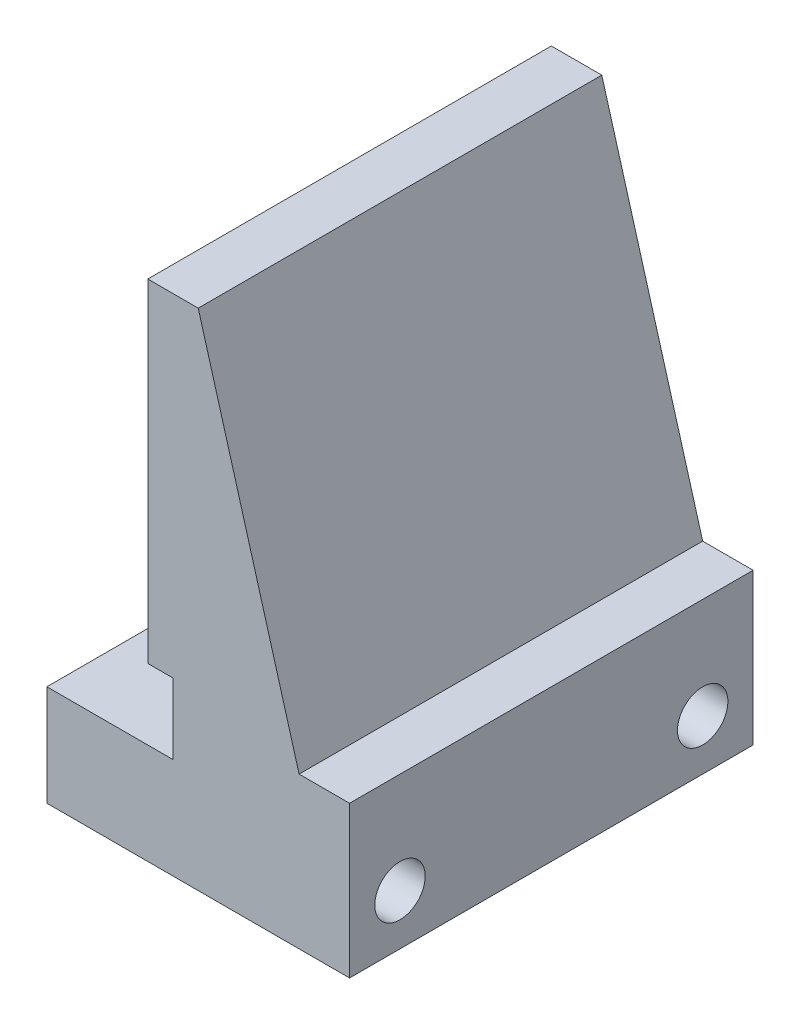
ISO-10303-21;
HEADER;
FILE_DESCRIPTION(('STEP AP214'),'2;1');
FILE_NAME('part.step','',(''),(''),'','','');
FILE_SCHEMA(('AUTOMOTIVE_DESIGN { 1 0 10303 214 1 1 1 1 }'));
ENDSEC;
DATA;
#1=APPLICATION_CONTEXT('core data for automotive mechanical design processes');
#2=APPLICATION_PROTOCOL_DEFINITION('international standard','automotive_design',2000,#1);
#3=PRODUCT_CONTEXT('',#1,'mechanical');
#4=PRODUCT('Part','Part','',(#3));
#5=PRODUCT_RELATED_PRODUCT_CATEGORY('part','',(#4));
#6=PRODUCT_DEFINITION_FORMATION('','',#4);
#7=PRODUCT_DEFINITION_CONTEXT('part definition',#1,'design');
#8=PRODUCT_DEFINITION('design','',#6,#7);
#9=PRODUCT_DEFINITION_SHAPE('','',#8);
#10=(LENGTH_UNIT() NAMED_UNIT(*) SI_UNIT(.MILLI.,.METRE.));
#11=(NAMED_UNIT(*) PLANE_ANGLE_UNIT() SI_UNIT($,.RADIAN.));
#12=(NAMED_UNIT(*) SI_UNIT($,.STERADIAN.) SOLID_ANGLE_UNIT());
#13=UNCERTAINTY_MEASURE_WITH_UNIT(LENGTH_MEASURE(1.E-05),#10,'distance_accuracy_value','');
#14=(GEOMETRIC_REPRESENTATION_CONTEXT(3) GLOBAL_UNCERTAINTY_ASSIGNED_CONTEXT((#13)) GLOBAL_UNIT_ASSIGNED_CONTEXT((#10,
#11,#12)) REPRESENTATION_CONTEXT('',''));
#15=CARTESIAN_POINT('',(0.,0.,0.));
#16=DIRECTION('',(0.,0.,1.));
#17=DIRECTION('',(1.,0.,0.));
#18=AXIS2_PLACEMENT_3D('',#15,#16,#17);
#19=CARTESIAN_POINT('',(-4.43980446416585E-06,1.60000000001081,40.));
#20=DIRECTION('',(1.,0.,0.));
#21=DIRECTION('',(0.,1.,0.));
#22=AXIS2_PLACEMENT_3D('',#19,#20,#21);
#23=PLANE('',#22);
#24=DIRECTION('',(0.,-1.,0.));
#25=VECTOR('',#24,1.);
#26=CARTESIAN_POINT('',(-4.43980446416585E-06,1.60000000001081,0.));
#27=LINE('',#26,#25);
#28=CARTESIAN_POINT('',(-4.43980446415395E-06,34.6000000000108,0.));
#29=VERTEX_POINT('',#28);
#30=CARTESIAN_POINT('',(-4.43980446416585E-06,1.60000000001081,0.));
#31=VERTEX_POINT('',#30);
#32=EDGE_CURVE('E148',#29,#31,#27,.T.);
#33=ORIENTED_EDGE('',*,*,#32,.T.);
#34=DIRECTION('',(0.,0.,-1.));
#35=VECTOR('',#34,1.);
#36=CARTESIAN_POINT('',(-4.43980446416585E-06,1.60000000001081,40.));
#37=LINE('',#36,#35);
#38=CARTESIAN_POINT('',(-4.43980446416585E-06,1.60000000001081,40.));
#39=VERTEX_POINT('',#38);
#40=EDGE_CURVE('E47',#39,#31,#37,.T.);
#41=ORIENTED_EDGE('',*,*,#40,.F.);
#42=DIRECTION('',(0.,-1.,0.));
#43=VECTOR('',#42,1.);
#44=CARTESIAN_POINT('',(-4.43980446416585E-06,1.60000000001081,40.));
#45=LINE('',#44,#43);
#46=CARTESIAN_POINT('',(-4.43980446415395E-06,34.6000000000108,40.));
#47=VERTEX_POINT('',#46);
#48=EDGE_CURVE('E170',#47,#39,#45,.T.);
#49=ORIENTED_EDGE('',*,*,#48,.F.);
#50=DIRECTION('',(0.,0.,-1.));
#51=VECTOR('',#50,1.);
#52=CARTESIAN_POINT('',(-4.43980446415395E-06,34.6000000000108,40.));
#53=LINE('',#52,#51);
#54=EDGE_CURVE('E144',#47,#29,#53,.T.);
#55=ORIENTED_EDGE('',*,*,#54,.T.);
#56=EDGE_LOOP('',(#33,#41,#49,#55));
#57=FACE_BOUND('',#56,.T.);
#58=ADVANCED_FACE('F39',(#57),#23,.F.);
#59=CARTESIAN_POINT('',(2.49999556019554,1.60000000001081,40.));
#60=DIRECTION('',(0.,1.,0.));
#61=DIRECTION('',(0.,0.,1.));
#62=AXIS2_PLACEMENT_3D('',#59,#60,#61);
#63=PLANE('',#62);
#64=DIRECTION('',(1.,0.,0.));
#65=VECTOR('',#64,1.);
#66=CARTESIAN_POINT('',(2.49999556019554,1.60000000001081,0.));
#67=LINE('',#66,#65);
#68=CARTESIAN_POINT('',(2.49999556019554,1.60000000001081,0.));
#69=VERTEX_POINT('',#68);
#70=EDGE_CURVE('E151',#31,#69,#67,.T.);
#71=ORIENTED_EDGE('',*,*,#70,.T.);
#72=DIRECTION('',(0.,0.,-1.));
#73=VECTOR('',#72,1.);
#74=CARTESIAN_POINT('',(2.49999556019554,1.60000000001081,40.));
#75=LINE('',#74,#73);
#76=CARTESIAN_POINT('',(2.49999556019554,1.60000000001081,40.));
#77=VERTEX_POINT('',#76);
#78=EDGE_CURVE('E186',#77,#69,#75,.T.);
#79=ORIENTED_EDGE('',*,*,#78,.F.);
#80=DIRECTION('',(1.,0.,0.));
#81=VECTOR('',#80,1.);
#82=CARTESIAN_POINT('',(2.49999556019554,1.60000000001081,40.));
#83=LINE('',#82,#81);
#84=EDGE_CURVE('E105',#39,#77,#83,.T.);
#85=ORIENTED_EDGE('',*,*,#84,.F.);
#86=ORIENTED_EDGE('',*,*,#40,.T.);
#87=EDGE_LOOP('',(#71,#79,#85,#86));
#88=FACE_BOUND('',#87,.T.);
#89=ADVANCED_FACE('F189',(#88),#63,.F.);
#90=CARTESIAN_POINT('',(2.49999556019554,-5.39999999998919,40.));
#91=DIRECTION('',(1.,0.,0.));
#92=DIRECTION('',(0.,0.,-1.));
#93=AXIS2_PLACEMENT_3D('',#90,#91,#92);
#94=PLANE('',#93);
#95=DIRECTION('',(0.,-1.,0.));
#96=VECTOR('',#95,1.);
#97=CARTESIAN_POINT('',(2.49999556019554,-5.39999999998919,0.));
#98=LINE('',#97,#96);
#99=CARTESIAN_POINT('',(2.49999556019554,-5.39999999998919,0.));
#100=VERTEX_POINT('',#99);
#101=EDGE_CURVE('E154',#69,#100,#98,.T.);
#102=ORIENTED_EDGE('',*,*,#101,.T.);
#103=DIRECTION('',(0.,0.,-1.));
#104=VECTOR('',#103,1.);
#105=CARTESIAN_POINT('',(2.49999556019554,-5.39999999998919,40.));
#106=LINE('',#105,#104);
#107=CARTESIAN_POINT('',(2.49999556019554,-5.39999999998919,40.));
#108=VERTEX_POINT('',#107);
#109=EDGE_CURVE('E183',#108,#100,#106,.T.);
#110=ORIENTED_EDGE('',*,*,#109,.F.);
#111=DIRECTION('',(0.,-1.,0.));
#112=VECTOR('',#111,1.);
#113=CARTESIAN_POINT('',(2.49999556019554,-5.39999999998919,40.));
#114=LINE('',#113,#112);
#115=EDGE_CURVE('E208',#77,#108,#114,.T.);
#116=ORIENTED_EDGE('',*,*,#115,.F.);
#117=ORIENTED_EDGE('',*,*,#78,.T.);
#118=EDGE_LOOP('',(#102,#110,#116,#117));
#119=FACE_BOUND('',#118,.T.);
#120=ADVANCED_FACE('F199',(#119),#94,.F.);
#121=CARTESIAN_POINT('',(-4.43980446415395E-06,-5.39999999998919,40.));
#122=DIRECTION('',(0.,-1.,0.));
#123=DIRECTION('',(0.,0.,-1.));
#124=AXIS2_PLACEMENT_3D('',#121,#122,#123);
#125=PLANE('',#124);
#126=CARTESIAN_POINT('',(-5.00000443980446,-5.39999999998919,20.));
#127=DIRECTION('',(0.,-1.,0.));
#128=DIRECTION('',(0.,0.,-1.));
#129=AXIS2_PLACEMENT_3D('',#126,#127,#128);
#130=CIRCLE('',#129,0.75);
#131=CARTESIAN_POINT('',(-5.00000443980446,-5.39999999998919,19.25));
#132=VERTEX_POINT('',#131);
#133=EDGE_CURVE('E11',#132,#132,#130,.F.);
#134=ORIENTED_EDGE('',*,*,#133,.F.);
#135=EDGE_LOOP('',(#134));
#136=FACE_BOUND('',#135,.T.);
#137=DIRECTION('',(-1.,0.,0.));
#138=VECTOR('',#137,1.);
#139=CARTESIAN_POINT('',(-4.43980446415395E-06,-5.39999999998919,0.));
#140=LINE('',#139,#138);
#141=CARTESIAN_POINT('',(-10.0000044398045,-5.39999999998919,0.));
#142=VERTEX_POINT('',#141);
#143=EDGE_CURVE('E157',#100,#142,#140,.T.);
#144=ORIENTED_EDGE('',*,*,#143,.T.);
#145=DIRECTION('',(0.,0.,-1.));
#146=VECTOR('',#145,1.);
#147=CARTESIAN_POINT('',(-10.0000044398045,-5.39999999998919,40.));
#148=LINE('',#147,#146);
#149=CARTESIAN_POINT('',(-10.0000044398045,-5.39999999998919,40.));
#150=VERTEX_POINT('',#149);
#151=EDGE_CURVE('E180',#150,#142,#148,.T.);
#152=ORIENTED_EDGE('',*,*,#151,.F.);
#153=DIRECTION('',(-1.,0.,0.));
#154=VECTOR('',#153,1.);
#155=CARTESIAN_POINT('',(-4.43980446415395E-06,-5.39999999998919,40.));
#156=LINE('',#155,#154);
#157=EDGE_CURVE('E205',#108,#150,#156,.T.);
#158=ORIENTED_EDGE('',*,*,#157,.F.);
#159=ORIENTED_EDGE('',*,*,#109,.T.);
#160=EDGE_LOOP('',(#144,#152,#158,#159));
#161=FACE_BOUND('',#160,.T.);
#162=ADVANCED_FACE('F203',(#136,#161),#125,.F.);
#163=CARTESIAN_POINT('',(-10.0000044398045,-5.39999999998919,40.));
#164=DIRECTION('',(1.,0.,0.));
#165=DIRECTION('',(0.,1.,0.));
#166=AXIS2_PLACEMENT_3D('',#163,#164,#165);
#167=PLANE('',#166);
#168=CARTESIAN_POINT('',(-10.0000044398045,-10.3999999999858,35.));
#169=DIRECTION('',(1.,0.,0.));
#170=DIRECTION('',(0.,0.,-1.));
#171=AXIS2_PLACEMENT_3D('',#168,#169,#170);
#172=CIRCLE('',#171,2.5);
#173=CARTESIAN_POINT('',(-10.0000044398045,-10.3999999999858,32.5));
#174=VERTEX_POINT('',#173);
#175=EDGE_CURVE('E152',#174,#174,#172,.T.);
#176=ORIENTED_EDGE('',*,*,#175,.T.);
#177=EDGE_LOOP('',(#176));
#178=FACE_BOUND('',#177,.T.);
#179=CARTESIAN_POINT('',(-10.0000044398045,-10.3999999999858,5.));
#180=DIRECTION('',(1.,0.,0.));
#181=DIRECTION('',(0.,0.,-1.));
#182=AXIS2_PLACEMENT_3D('',#179,#180,#181);
#183=CIRCLE('',#182,2.5);
#184=CARTESIAN_POINT('',(-10.0000044398045,-10.3999999999858,2.5));
#185=VERTEX_POINT('',#184);
#186=EDGE_CURVE('E347',#185,#185,#183,.T.);
#187=ORIENTED_EDGE('',*,*,#186,.T.);
#188=EDGE_LOOP('',(#187));
#189=FACE_BOUND('',#188,.T.);
#190=DIRECTION('',(0.,-1.,0.));
#191=VECTOR('',#190,1.);
#192=CARTESIAN_POINT('',(-10.0000044398045,-5.39999999998919,0.));
#193=LINE('',#192,#191);
#194=CARTESIAN_POINT('',(-10.0000044398045,-15.3999999999858,0.));
#195=VERTEX_POINT('',#194);
#196=EDGE_CURVE('E159',#142,#195,#193,.T.);
#197=ORIENTED_EDGE('',*,*,#196,.T.);
#198=DIRECTION('',(0.,0.,-1.));
#199=VECTOR('',#198,1.);
#200=CARTESIAN_POINT('',(-10.0000044398045,-15.3999999999858,40.));
#201=LINE('',#200,#199);
#202=CARTESIAN_POINT('',(-10.0000044398045,-15.3999999999858,40.));
#203=VERTEX_POINT('',#202);
#204=EDGE_CURVE('E177',#203,#195,#201,.T.);
#205=ORIENTED_EDGE('',*,*,#204,.F.);
#206=DIRECTION('',(0.,-1.,0.));
#207=VECTOR('',#206,1.);
#208=CARTESIAN_POINT('',(-10.0000044398045,-5.39999999998919,40.));
#209=LINE('',#208,#207);
#210=EDGE_CURVE('E207',#150,#203,#209,.T.);
#211=ORIENTED_EDGE('',*,*,#210,.F.);
#212=ORIENTED_EDGE('',*,*,#151,.T.);
#213=EDGE_LOOP('',(#197,#205,#211,#212));
#214=FACE_BOUND('',#213,.T.);
#215=ADVANCED_FACE('F223',(#178,#189,#214),#167,.F.);
#216=CARTESIAN_POINT('',(-1.26616645829713E-05,-15.3999999999858,40.));
#217=DIRECTION('',(0.,1.,0.));
#218=DIRECTION('',(0.,0.,1.));
#219=AXIS2_PLACEMENT_3D('',#216,#217,#218);
#220=PLANE('',#219);
#221=DIRECTION('',(1.,0.,0.));
#222=VECTOR('',#221,1.);
#223=CARTESIAN_POINT('',(-1.26616645829713E-05,-15.3999999999858,0.));
#224=LINE('',#223,#222);
#225=CARTESIAN_POINT('',(19.9999955601955,-15.3999999999858,0.));
#226=VERTEX_POINT('',#225);
#227=EDGE_CURVE('E162',#195,#226,#224,.T.);
#228=ORIENTED_EDGE('',*,*,#227,.T.);
#229=DIRECTION('',(0.,0.,-1.));
#230=VECTOR('',#229,1.);
#231=CARTESIAN_POINT('',(19.9999955601955,-15.3999999999858,40.));
#232=LINE('',#231,#230);
#233=CARTESIAN_POINT('',(19.9999955601955,-15.3999999999858,40.));
#234=VERTEX_POINT('',#233);
#235=EDGE_CURVE('E174',#234,#226,#232,.T.);
#236=ORIENTED_EDGE('',*,*,#235,.F.);
#237=DIRECTION('',(1.,0.,0.));
#238=VECTOR('',#237,1.);
#239=CARTESIAN_POINT('',(-10.0000044398045,-15.3999999999858,40.));
#240=LINE('',#239,#238);
#241=EDGE_CURVE('E210',#203,#234,#240,.T.);
#242=ORIENTED_EDGE('',*,*,#241,.F.);
#243=ORIENTED_EDGE('',*,*,#204,.T.);
#244=EDGE_LOOP('',(#228,#236,#242,#243));
#245=FACE_BOUND('',#244,.T.);
#246=ADVANCED_FACE('F219',(#245),#220,.F.);
#247=CARTESIAN_POINT('',(19.9999955601955,-5.39999999998919,40.));
#248=DIRECTION('',(-1.,0.,0.));
#249=DIRECTION('',(0.,0.,1.));
#250=AXIS2_PLACEMENT_3D('',#247,#248,#249);
#251=PLANE('',#250);
#252=CARTESIAN_POINT('',(19.9999955601955,-10.3999999999858,35.));
#253=DIRECTION('',(1.,0.,0.));
#254=DIRECTION('',(0.,0.,-1.));
#255=AXIS2_PLACEMENT_3D('',#252,#253,#254);
#256=CIRCLE('',#255,2.5);
#257=CARTESIAN_POINT('',(19.9999955601955,-10.3999999999858,32.5));
#258=VERTEX_POINT('',#257);
#259=EDGE_CURVE('E342',#258,#258,#256,.T.);
#260=ORIENTED_EDGE('',*,*,#259,.F.);
#261=EDGE_LOOP('',(#260));
#262=FACE_BOUND('',#261,.T.);
#263=CARTESIAN_POINT('',(19.9999955601955,-10.3999999999858,5.));
#264=DIRECTION('',(1.,0.,0.));
#265=DIRECTION('',(0.,0.,-1.));
#266=AXIS2_PLACEMENT_3D('',#263,#264,#265);
#267=CIRCLE('',#266,2.5);
#268=CARTESIAN_POINT('',(19.9999955601955,-10.3999999999858,2.5));
#269=VERTEX_POINT('',#268);
#270=EDGE_CURVE('E345',#269,#269,#267,.T.);
#271=ORIENTED_EDGE('',*,*,#270,.F.);
#272=EDGE_LOOP('',(#271));
#273=FACE_BOUND('',#272,.T.);
#274=DIRECTION('',(0.,1.,0.));
#275=VECTOR('',#274,1.);
#276=CARTESIAN_POINT('',(19.9999955601955,-5.39999999998919,0.));
#277=LINE('',#276,#275);
#278=CARTESIAN_POINT('',(19.9999955601955,-0.399999999989187,0.));
#279=VERTEX_POINT('',#278);
#280=EDGE_CURVE('E165',#226,#279,#277,.T.);
#281=ORIENTED_EDGE('',*,*,#280,.T.);
#282=DIRECTION('',(0.,0.,-1.));
#283=VECTOR('',#282,1.);
#284=CARTESIAN_POINT('',(19.9999955601955,-0.399999999989187,40.));
#285=LINE('',#284,#283);
#286=CARTESIAN_POINT('',(19.9999955601955,-0.399999999989187,40.));
#287=VERTEX_POINT('',#286);
#288=EDGE_CURVE('E139',#287,#279,#285,.T.);
#289=ORIENTED_EDGE('',*,*,#288,.F.);
#290=DIRECTION('',(0.,1.,0.));
#291=VECTOR('',#290,1.);
#292=CARTESIAN_POINT('',(19.9999955601955,-15.3999999999858,40.));
#293=LINE('',#292,#291);
#294=EDGE_CURVE('E130',#234,#287,#293,.T.);
#295=ORIENTED_EDGE('',*,*,#294,.F.);
#296=ORIENTED_EDGE('',*,*,#235,.T.);
#297=EDGE_LOOP('',(#281,#289,#295,#296));
#298=FACE_BOUND('',#297,.T.);
#299=ADVANCED_FACE('F221',(#262,#273,#298),#251,.F.);
#300=CARTESIAN_POINT('',(14.9999955601955,-0.399999999989187,40.));
#301=DIRECTION('',(0.,-1.,0.));
#302=DIRECTION('',(0.,0.,-1.));
#303=AXIS2_PLACEMENT_3D('',#300,#301,#302);
#304=PLANE('',#303);
#305=DIRECTION('',(-1.,0.,0.));
#306=VECTOR('',#305,1.);
#307=CARTESIAN_POINT('',(14.9999955601955,-0.399999999989187,0.));
#308=LINE('',#307,#306);
#309=CARTESIAN_POINT('',(14.9999955601955,-0.399999999989187,0.));
#310=VERTEX_POINT('',#309);
#311=EDGE_CURVE('E138',#279,#310,#308,.T.);
#312=ORIENTED_EDGE('',*,*,#311,.T.);
#313=DIRECTION('',(0.,0.,-1.));
#314=VECTOR('',#313,1.);
#315=CARTESIAN_POINT('',(14.9999955601955,-0.399999999989187,40.));
#316=LINE('',#315,#314);
#317=CARTESIAN_POINT('',(14.9999955601955,-0.399999999989187,40.));
#318=VERTEX_POINT('',#317);
#319=EDGE_CURVE('E135',#318,#310,#316,.T.);
#320=ORIENTED_EDGE('',*,*,#319,.F.);
#321=DIRECTION('',(-1.,0.,0.));
#322=VECTOR('',#321,1.);
#323=CARTESIAN_POINT('',(14.9999955601955,-0.399999999989187,40.));
#324=LINE('',#323,#322);
#325=EDGE_CURVE('E124',#287,#318,#324,.T.);
#326=ORIENTED_EDGE('',*,*,#325,.F.);
#327=ORIENTED_EDGE('',*,*,#288,.T.);
#328=EDGE_LOOP('',(#312,#320,#326,#327));
#329=FACE_BOUND('',#328,.T.);
#330=ADVANCED_FACE('F136',(#329),#304,.F.);
#331=CARTESIAN_POINT('',(4.99999556019554,34.6000000000108,40.));
#332=DIRECTION('',(-0.961523947640823,-0.274721127897378,0.));
#333=DIRECTION('',(0.274721127897378,-0.961523947640823,0.));
#334=AXIS2_PLACEMENT_3D('',#331,#332,#333);
#335=PLANE('',#334);
#336=DIRECTION('',(-0.274721127897378,0.961523947640823,0.));
#337=VECTOR('',#336,1.);
#338=CARTESIAN_POINT('',(4.99999556019554,34.6000000000108,0.));
#339=LINE('',#338,#337);
#340=CARTESIAN_POINT('',(4.99999556019554,34.6000000000108,0.));
#341=VERTEX_POINT('',#340);
#342=EDGE_CURVE('E90',#310,#341,#339,.T.);
#343=ORIENTED_EDGE('',*,*,#342,.T.);
#344=DIRECTION('',(0.,0.,-1.));
#345=VECTOR('',#344,1.);
#346=CARTESIAN_POINT('',(4.99999556019554,34.6000000000108,40.));
#347=LINE('',#346,#345);
#348=CARTESIAN_POINT('',(4.99999556019554,34.6000000000108,40.));
#349=VERTEX_POINT('',#348);
#350=EDGE_CURVE('E140',#349,#341,#347,.T.);
#351=ORIENTED_EDGE('',*,*,#350,.F.);
#352=DIRECTION('',(-0.274721127897378,0.961523947640823,0.));
#353=VECTOR('',#352,1.);
#354=CARTESIAN_POINT('',(4.99999556019554,34.6000000000108,40.));
#355=LINE('',#354,#353);
#356=EDGE_CURVE('E128',#318,#349,#355,.T.);
#357=ORIENTED_EDGE('',*,*,#356,.F.);
#358=ORIENTED_EDGE('',*,*,#319,.T.);
#359=EDGE_LOOP('',(#343,#351,#357,#358));
#360=FACE_BOUND('',#359,.T.);
#361=ADVANCED_FACE('F142',(#360),#335,.F.);
#362=CARTESIAN_POINT('',(-4.43980446415395E-06,34.6000000000108,40.));
#363=DIRECTION('',(0.,-1.,0.));
#364=DIRECTION('',(0.,0.,-1.));
#365=AXIS2_PLACEMENT_3D('',#362,#363,#364);
#366=PLANE('',#365);
#367=DIRECTION('',(-1.,0.,0.));
#368=VECTOR('',#367,1.);
#369=CARTESIAN_POINT('',(-4.43980446415395E-06,34.6000000000108,0.));
#370=LINE('',#369,#368);
#371=EDGE_CURVE('E96',#341,#29,#370,.T.);
#372=ORIENTED_EDGE('',*,*,#371,.T.);
#373=ORIENTED_EDGE('',*,*,#54,.F.);
#374=DIRECTION('',(-1.,0.,0.));
#375=VECTOR('',#374,1.);
#376=CARTESIAN_POINT('',(-4.43980446415395E-06,34.6000000000108,40.));
#377=LINE('',#376,#375);
#378=EDGE_CURVE('E55',#349,#47,#377,.T.);
#379=ORIENTED_EDGE('',*,*,#378,.F.);
#380=ORIENTED_EDGE('',*,*,#350,.T.);
#381=EDGE_LOOP('',(#372,#373,#379,#380));
#382=FACE_BOUND('',#381,.T.);
#383=ADVANCED_FACE('F270',(#382),#366,.F.);
#384=CARTESIAN_POINT('',(0.,0.,40.));
#385=DIRECTION('',(0.,0.,-1.));
#386=DIRECTION('',(-1.,0.,0.));
#387=AXIS2_PLACEMENT_3D('',#384,#385,#386);
#388=PLANE('',#387);
#389=ORIENTED_EDGE('',*,*,#48,.T.);
#390=ORIENTED_EDGE('',*,*,#84,.T.);
#391=ORIENTED_EDGE('',*,*,#115,.T.);
#392=ORIENTED_EDGE('',*,*,#157,.T.);
#393=ORIENTED_EDGE('',*,*,#210,.T.);
#394=ORIENTED_EDGE('',*,*,#241,.T.);
#395=ORIENTED_EDGE('',*,*,#294,.T.);
#396=ORIENTED_EDGE('',*,*,#325,.T.);
#397=ORIENTED_EDGE('',*,*,#356,.T.);
#398=ORIENTED_EDGE('',*,*,#378,.T.);
#399=EDGE_LOOP('',(#389,#390,#391,#392,#393,#394,#395,#396,#397,#398));
#400=FACE_BOUND('',#399,.T.);
#401=ADVANCED_FACE('F126',(#400),#388,.F.);
#402=CARTESIAN_POINT('',(0.,0.,0.));
#403=DIRECTION('',(0.,0.,-1.));
#404=DIRECTION('',(-1.,0.,0.));
#405=AXIS2_PLACEMENT_3D('',#402,#403,#404);
#406=PLANE('',#405);
#407=ORIENTED_EDGE('',*,*,#32,.F.);
#408=ORIENTED_EDGE('',*,*,#371,.F.);
#409=ORIENTED_EDGE('',*,*,#342,.F.);
#410=ORIENTED_EDGE('',*,*,#311,.F.);
#411=ORIENTED_EDGE('',*,*,#280,.F.);
#412=ORIENTED_EDGE('',*,*,#227,.F.);
#413=ORIENTED_EDGE('',*,*,#196,.F.);
#414=ORIENTED_EDGE('',*,*,#143,.F.);
#415=ORIENTED_EDGE('',*,*,#101,.F.);
#416=ORIENTED_EDGE('',*,*,#70,.F.);
#417=EDGE_LOOP('',(#407,#408,#409,#410,#411,#412,#413,#414,#415,#416));
#418=FACE_BOUND('',#417,.T.);
#419=ADVANCED_FACE('F194',(#418),#406,.T.);
#420=CARTESIAN_POINT('',(-10.0000044398045,-10.3999999999858,5.));
#421=DIRECTION('',(1.,0.,0.));
#422=DIRECTION('',(0.,0.,-1.));
#423=AXIS2_PLACEMENT_3D('',#420,#421,#422);
#424=CYLINDRICAL_SURFACE('',#423,2.5);
#425=ORIENTED_EDGE('',*,*,#186,.F.);
#426=EDGE_LOOP('',(#425));
#427=FACE_BOUND('',#426,.T.);
#428=ORIENTED_EDGE('',*,*,#270,.T.);
#429=EDGE_LOOP('',(#428));
#430=FACE_BOUND('',#429,.T.);
#431=ADVANCED_FACE('F290',(#427,#430),#424,.F.);
#432=CARTESIAN_POINT('',(-10.0000044398045,-10.3999999999858,35.));
#433=DIRECTION('',(1.,0.,0.));
#434=DIRECTION('',(0.,0.,-1.));
#435=AXIS2_PLACEMENT_3D('',#432,#433,#434);
#436=CYLINDRICAL_SURFACE('',#435,2.5);
#437=ORIENTED_EDGE('',*,*,#175,.F.);
#438=EDGE_LOOP('',(#437));
#439=FACE_BOUND('',#438,.T.);
#440=ORIENTED_EDGE('',*,*,#259,.T.);
#441=EDGE_LOOP('',(#440));
#442=FACE_BOUND('',#441,.T.);
#443=ADVANCED_FACE('F302',(#439,#442),#436,.F.);
#444=CARTESIAN_POINT('',(-5.00000443980446,-0.399999999989187,20.));
#445=DIRECTION('',(0.,-1.,0.));
#446=DIRECTION('',(0.,0.,-1.));
#447=AXIS2_PLACEMENT_3D('',#444,#445,#446);
#448=CYLINDRICAL_SURFACE('',#447,0.75);
#449=CARTESIAN_POINT('',(-5.00000443980446,-0.399999999989187,20.));
#450=DIRECTION('',(0.,1.,0.));
#451=DIRECTION('',(0.,0.,1.));
#452=AXIS2_PLACEMENT_3D('',#449,#450,#451);
#453=CIRCLE('',#452,0.75);
#454=CARTESIAN_POINT('',(-5.00000443980446,-0.399999999989187,20.75));
#455=VERTEX_POINT('',#454);
#456=EDGE_CURVE('E351',#455,#455,#453,.T.);
#457=ORIENTED_EDGE('',*,*,#456,.F.);
#458=EDGE_LOOP('',(#457));
#459=FACE_BOUND('',#458,.T.);
#460=ORIENTED_EDGE('',*,*,#133,.T.);
#461=EDGE_LOOP('',(#460));
#462=FACE_BOUND('',#461,.T.);
#463=ADVANCED_FACE('F312',(#459,#462),#448,.T.);
#464=CARTESIAN_POINT('',(-5.00000443980446,-0.399999999989187,20.));
#465=DIRECTION('',(0.,1.,0.));
#466=DIRECTION('',(0.,0.,1.));
#467=AXIS2_PLACEMENT_3D('',#464,#465,#466);
#468=PLANE('',#467);
#469=ORIENTED_EDGE('',*,*,#456,.T.);
#470=EDGE_LOOP('',(#469));
#471=FACE_BOUND('',#470,.T.);
#472=ADVANCED_FACE('F322',(#471),#468,.T.);
#473=CLOSED_SHELL('',(#58,#89,#120,#162,#215,#246,#299,#330,#361,#383,#401,#419,#431,#443,#463,#472));
#474=MANIFOLD_SOLID_BREP('B2',#473);
#475=ADVANCED_BREP_SHAPE_REPRESENTATION('',(#18,#474),#14);
#476=SHAPE_DEFINITION_REPRESENTATION(#9,#475);
ENDSEC;
END-ISO-10303-21;
